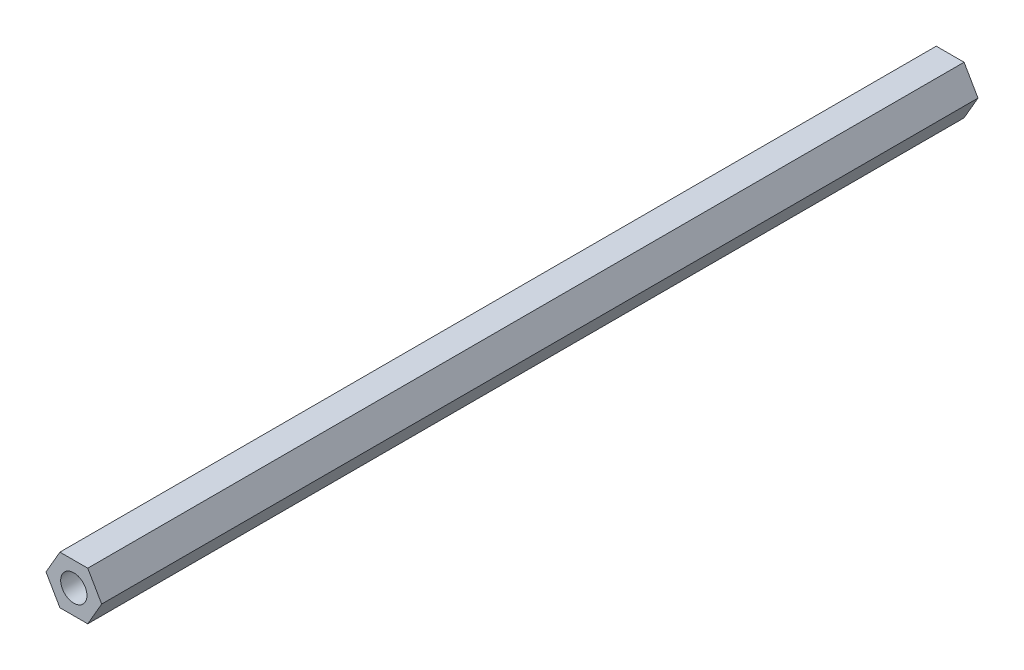
ISO-10303-21;
HEADER;
FILE_DESCRIPTION(('STEP AP214'),'2;1');
FILE_NAME('part.step','',(''),(''),'','','');
FILE_SCHEMA(('AUTOMOTIVE_DESIGN { 1 0 10303 214 1 1 1 1 }'));
ENDSEC;
DATA;
#1=APPLICATION_CONTEXT('core data for automotive mechanical design processes');
#2=APPLICATION_PROTOCOL_DEFINITION('international standard','automotive_design',2000,#1);
#3=PRODUCT_CONTEXT('',#1,'mechanical');
#4=PRODUCT('Part','Part','',(#3));
#5=PRODUCT_RELATED_PRODUCT_CATEGORY('part','',(#4));
#6=PRODUCT_DEFINITION_FORMATION('','',#4);
#7=PRODUCT_DEFINITION_CONTEXT('part definition',#1,'design');
#8=PRODUCT_DEFINITION('design','',#6,#7);
#9=PRODUCT_DEFINITION_SHAPE('','',#8);
#10=(LENGTH_UNIT() NAMED_UNIT(*) SI_UNIT(.MILLI.,.METRE.));
#11=(NAMED_UNIT(*) PLANE_ANGLE_UNIT() SI_UNIT($,.RADIAN.));
#12=(NAMED_UNIT(*) SI_UNIT($,.STERADIAN.) SOLID_ANGLE_UNIT());
#13=UNCERTAINTY_MEASURE_WITH_UNIT(LENGTH_MEASURE(1.E-05),#10,'distance_accuracy_value','');
#14=(GEOMETRIC_REPRESENTATION_CONTEXT(3) GLOBAL_UNCERTAINTY_ASSIGNED_CONTEXT((#13)) GLOBAL_UNIT_ASSIGNED_CONTEXT((#10,
#11,#12)) REPRESENTATION_CONTEXT('',''));
#15=CARTESIAN_POINT('',(0.,0.,0.));
#16=DIRECTION('',(0.,0.,1.));
#17=DIRECTION('',(1.,0.,0.));
#18=AXIS2_PLACEMENT_3D('',#15,#16,#17);
#19=CARTESIAN_POINT('',(-1.58771324027147,-2.75,100.));
#20=DIRECTION('',(0.,1.,0.));
#21=DIRECTION('',(-1.,0.,0.));
#22=AXIS2_PLACEMENT_3D('',#19,#20,#21);
#23=PLANE('',#22);
#24=DIRECTION('',(1.,0.,0.));
#25=VECTOR('',#24,1.);
#26=CARTESIAN_POINT('',(-1.58771324027147,-2.75,0.));
#27=LINE('',#26,#25);
#28=CARTESIAN_POINT('',(-1.58771324027147,-2.75,0.));
#29=VERTEX_POINT('',#28);
#30=CARTESIAN_POINT('',(1.58771324027147,-2.75,0.));
#31=VERTEX_POINT('',#30);
#32=EDGE_CURVE('E119',#29,#31,#27,.T.);
#33=ORIENTED_EDGE('',*,*,#32,.T.);
#34=DIRECTION('',(0.,0.,-1.));
#35=VECTOR('',#34,1.);
#36=CARTESIAN_POINT('',(1.58771324027147,-2.75,100.));
#37=LINE('',#36,#35);
#38=CARTESIAN_POINT('',(1.58771324027147,-2.75,100.));
#39=VERTEX_POINT('',#38);
#40=EDGE_CURVE('E11',#39,#31,#37,.T.);
#41=ORIENTED_EDGE('',*,*,#40,.F.);
#42=DIRECTION('',(1.,0.,0.));
#43=VECTOR('',#42,1.);
#44=CARTESIAN_POINT('',(-1.58771324027147,-2.75,100.));
#45=LINE('',#44,#43);
#46=CARTESIAN_POINT('',(-1.58771324027147,-2.75,100.));
#47=VERTEX_POINT('',#46);
#48=EDGE_CURVE('E130',#47,#39,#45,.T.);
#49=ORIENTED_EDGE('',*,*,#48,.F.);
#50=DIRECTION('',(0.,0.,-1.));
#51=VECTOR('',#50,1.);
#52=CARTESIAN_POINT('',(-1.58771324027147,-2.75,100.));
#53=LINE('',#52,#51);
#54=EDGE_CURVE('E115',#47,#29,#53,.T.);
#55=ORIENTED_EDGE('',*,*,#54,.T.);
#56=EDGE_LOOP('',(#33,#41,#49,#55));
#57=FACE_BOUND('',#56,.T.);
#58=ADVANCED_FACE('F35',(#57),#23,.F.);
#59=CARTESIAN_POINT('',(1.58771324027147,-2.75,100.));
#60=DIRECTION('',(-0.866025403784439,0.5,0.));
#61=DIRECTION('',(-0.5,-0.866025403784439,0.));
#62=AXIS2_PLACEMENT_3D('',#59,#60,#61);
#63=PLANE('',#62);
#64=DIRECTION('',(0.5,0.866025403784439,0.));
#65=VECTOR('',#64,1.);
#66=CARTESIAN_POINT('',(1.58771324027147,-2.75,0.));
#67=LINE('',#66,#65);
#68=CARTESIAN_POINT('',(3.17542648054294,0.,0.));
#69=VERTEX_POINT('',#68);
#70=EDGE_CURVE('E122',#31,#69,#67,.T.);
#71=ORIENTED_EDGE('',*,*,#70,.T.);
#72=DIRECTION('',(0.,0.,-1.));
#73=VECTOR('',#72,1.);
#74=CARTESIAN_POINT('',(3.17542648054294,0.,100.));
#75=LINE('',#74,#73);
#76=CARTESIAN_POINT('',(3.17542648054294,0.,100.));
#77=VERTEX_POINT('',#76);
#78=EDGE_CURVE('E43',#77,#69,#75,.T.);
#79=ORIENTED_EDGE('',*,*,#78,.F.);
#80=DIRECTION('',(0.5,0.866025403784439,0.));
#81=VECTOR('',#80,1.);
#82=CARTESIAN_POINT('',(1.58771324027147,-2.75,100.));
#83=LINE('',#82,#81);
#84=EDGE_CURVE('E88',#39,#77,#83,.T.);
#85=ORIENTED_EDGE('',*,*,#84,.F.);
#86=ORIENTED_EDGE('',*,*,#40,.T.);
#87=EDGE_LOOP('',(#71,#79,#85,#86));
#88=FACE_BOUND('',#87,.T.);
#89=ADVANCED_FACE('F155',(#88),#63,.F.);
#90=CARTESIAN_POINT('',(3.17542648054294,0.,100.));
#91=DIRECTION('',(-0.866025403784439,-0.5,0.));
#92=DIRECTION('',(0.5,-0.866025403784439,0.));
#93=AXIS2_PLACEMENT_3D('',#90,#91,#92);
#94=PLANE('',#93);
#95=DIRECTION('',(-0.5,0.866025403784439,0.));
#96=VECTOR('',#95,1.);
#97=CARTESIAN_POINT('',(3.17542648054294,0.,0.));
#98=LINE('',#97,#96);
#99=CARTESIAN_POINT('',(1.58771324027147,2.75,0.));
#100=VERTEX_POINT('',#99);
#101=EDGE_CURVE('E125',#69,#100,#98,.T.);
#102=ORIENTED_EDGE('',*,*,#101,.T.);
#103=DIRECTION('',(0.,0.,-1.));
#104=VECTOR('',#103,1.);
#105=CARTESIAN_POINT('',(1.58771324027147,2.75,100.));
#106=LINE('',#105,#104);
#107=CARTESIAN_POINT('',(1.58771324027147,2.75,100.));
#108=VERTEX_POINT('',#107);
#109=EDGE_CURVE('E110',#108,#100,#106,.T.);
#110=ORIENTED_EDGE('',*,*,#109,.F.);
#111=DIRECTION('',(-0.5,0.866025403784439,0.));
#112=VECTOR('',#111,1.);
#113=CARTESIAN_POINT('',(3.17542648054294,0.,100.));
#114=LINE('',#113,#112);
#115=EDGE_CURVE('E101',#77,#108,#114,.T.);
#116=ORIENTED_EDGE('',*,*,#115,.F.);
#117=ORIENTED_EDGE('',*,*,#78,.T.);
#118=EDGE_LOOP('',(#102,#110,#116,#117));
#119=FACE_BOUND('',#118,.T.);
#120=ADVANCED_FACE('F136',(#119),#94,.F.);
#121=CARTESIAN_POINT('',(1.58771324027147,2.75,100.));
#122=DIRECTION('',(0.,-1.,0.));
#123=DIRECTION('',(1.,0.,0.));
#124=AXIS2_PLACEMENT_3D('',#121,#122,#123);
#125=PLANE('',#124);
#126=DIRECTION('',(-1.,0.,0.));
#127=VECTOR('',#126,1.);
#128=CARTESIAN_POINT('',(1.58771324027147,2.75,0.));
#129=LINE('',#128,#127);
#130=CARTESIAN_POINT('',(-1.58771324027147,2.75,0.));
#131=VERTEX_POINT('',#130);
#132=EDGE_CURVE('E109',#100,#131,#129,.T.);
#133=ORIENTED_EDGE('',*,*,#132,.T.);
#134=DIRECTION('',(0.,0.,-1.));
#135=VECTOR('',#134,1.);
#136=CARTESIAN_POINT('',(-1.58771324027147,2.75,100.));
#137=LINE('',#136,#135);
#138=CARTESIAN_POINT('',(-1.58771324027147,2.75,100.));
#139=VERTEX_POINT('',#138);
#140=EDGE_CURVE('E106',#139,#131,#137,.T.);
#141=ORIENTED_EDGE('',*,*,#140,.F.);
#142=DIRECTION('',(-1.,0.,0.));
#143=VECTOR('',#142,1.);
#144=CARTESIAN_POINT('',(1.58771324027147,2.75,100.));
#145=LINE('',#144,#143);
#146=EDGE_CURVE('E95',#108,#139,#145,.T.);
#147=ORIENTED_EDGE('',*,*,#146,.F.);
#148=ORIENTED_EDGE('',*,*,#109,.T.);
#149=EDGE_LOOP('',(#133,#141,#147,#148));
#150=FACE_BOUND('',#149,.T.);
#151=ADVANCED_FACE('F107',(#150),#125,.F.);
#152=CARTESIAN_POINT('',(-1.58771324027147,2.75,100.));
#153=DIRECTION('',(0.866025403784439,-0.5,0.));
#154=DIRECTION('',(0.5,0.866025403784439,0.));
#155=AXIS2_PLACEMENT_3D('',#152,#153,#154);
#156=PLANE('',#155);
#157=DIRECTION('',(-0.5,-0.866025403784439,0.));
#158=VECTOR('',#157,1.);
#159=CARTESIAN_POINT('',(-1.58771324027147,2.75,0.));
#160=LINE('',#159,#158);
#161=CARTESIAN_POINT('',(-3.17542648054294,0.,0.));
#162=VERTEX_POINT('',#161);
#163=EDGE_CURVE('E74',#131,#162,#160,.T.);
#164=ORIENTED_EDGE('',*,*,#163,.T.);
#165=DIRECTION('',(0.,0.,-1.));
#166=VECTOR('',#165,1.);
#167=CARTESIAN_POINT('',(-3.17542648054294,0.,100.));
#168=LINE('',#167,#166);
#169=CARTESIAN_POINT('',(-3.17542648054294,0.,100.));
#170=VERTEX_POINT('',#169);
#171=EDGE_CURVE('E111',#170,#162,#168,.T.);
#172=ORIENTED_EDGE('',*,*,#171,.F.);
#173=DIRECTION('',(-0.5,-0.866025403784439,0.));
#174=VECTOR('',#173,1.);
#175=CARTESIAN_POINT('',(-1.58771324027147,2.75,100.));
#176=LINE('',#175,#174);
#177=EDGE_CURVE('E99',#139,#170,#176,.T.);
#178=ORIENTED_EDGE('',*,*,#177,.F.);
#179=ORIENTED_EDGE('',*,*,#140,.T.);
#180=EDGE_LOOP('',(#164,#172,#178,#179));
#181=FACE_BOUND('',#180,.T.);
#182=ADVANCED_FACE('F113',(#181),#156,.F.);
#183=CARTESIAN_POINT('',(-3.17542648054294,0.,100.));
#184=DIRECTION('',(0.866025403784439,0.5,0.));
#185=DIRECTION('',(-0.5,0.866025403784439,0.));
#186=AXIS2_PLACEMENT_3D('',#183,#184,#185);
#187=PLANE('',#186);
#188=DIRECTION('',(0.5,-0.866025403784439,0.));
#189=VECTOR('',#188,1.);
#190=CARTESIAN_POINT('',(-3.17542648054294,0.,0.));
#191=LINE('',#190,#189);
#192=EDGE_CURVE('E80',#162,#29,#191,.T.);
#193=ORIENTED_EDGE('',*,*,#192,.T.);
#194=ORIENTED_EDGE('',*,*,#54,.F.);
#195=DIRECTION('',(0.5,-0.866025403784439,0.));
#196=VECTOR('',#195,1.);
#197=CARTESIAN_POINT('',(-3.17542648054294,0.,100.));
#198=LINE('',#197,#196);
#199=EDGE_CURVE('E51',#170,#47,#198,.T.);
#200=ORIENTED_EDGE('',*,*,#199,.F.);
#201=ORIENTED_EDGE('',*,*,#171,.T.);
#202=EDGE_LOOP('',(#193,#194,#200,#201));
#203=FACE_BOUND('',#202,.T.);
#204=ADVANCED_FACE('F143',(#203),#187,.F.);
#205=CARTESIAN_POINT('',(0.,0.,100.));
#206=DIRECTION('',(0.,0.,1.));
#207=DIRECTION('',(1.,0.,0.));
#208=AXIS2_PLACEMENT_3D('',#205,#206,#207);
#209=PLANE('',#208);
#210=CARTESIAN_POINT('',(0.,0.,100.));
#211=DIRECTION('',(0.,0.,1.));
#212=DIRECTION('',(1.,0.,0.));
#213=AXIS2_PLACEMENT_3D('',#210,#211,#212);
#214=CIRCLE('',#213,1.5);
#215=CARTESIAN_POINT('',(1.5,0.,100.));
#216=VERTEX_POINT('',#215);
#217=EDGE_CURVE('E239',#216,#216,#214,.T.);
#218=ORIENTED_EDGE('',*,*,#217,.F.);
#219=EDGE_LOOP('',(#218));
#220=FACE_BOUND('',#219,.T.);
#221=ORIENTED_EDGE('',*,*,#48,.T.);
#222=ORIENTED_EDGE('',*,*,#84,.T.);
#223=ORIENTED_EDGE('',*,*,#115,.T.);
#224=ORIENTED_EDGE('',*,*,#146,.T.);
#225=ORIENTED_EDGE('',*,*,#177,.T.);
#226=ORIENTED_EDGE('',*,*,#199,.T.);
#227=EDGE_LOOP('',(#221,#222,#223,#224,#225,#226));
#228=FACE_BOUND('',#227,.T.);
#229=ADVANCED_FACE('F97',(#220,#228),#209,.T.);
#230=CARTESIAN_POINT('',(0.,0.,0.));
#231=DIRECTION('',(0.,0.,1.));
#232=DIRECTION('',(1.,0.,0.));
#233=AXIS2_PLACEMENT_3D('',#230,#231,#232);
#234=PLANE('',#233);
#235=CARTESIAN_POINT('',(0.,0.,0.));
#236=DIRECTION('',(0.,0.,-1.));
#237=DIRECTION('',(-1.,0.,0.));
#238=AXIS2_PLACEMENT_3D('',#235,#236,#237);
#239=CIRCLE('',#238,1.5);
#240=CARTESIAN_POINT('',(-1.5,0.,0.));
#241=VERTEX_POINT('',#240);
#242=EDGE_CURVE('E238',#241,#241,#239,.T.);
#243=ORIENTED_EDGE('',*,*,#242,.F.);
#244=EDGE_LOOP('',(#243));
#245=FACE_BOUND('',#244,.T.);
#246=ORIENTED_EDGE('',*,*,#32,.F.);
#247=ORIENTED_EDGE('',*,*,#192,.F.);
#248=ORIENTED_EDGE('',*,*,#163,.F.);
#249=ORIENTED_EDGE('',*,*,#132,.F.);
#250=ORIENTED_EDGE('',*,*,#101,.F.);
#251=ORIENTED_EDGE('',*,*,#70,.F.);
#252=EDGE_LOOP('',(#246,#247,#248,#249,#250,#251));
#253=FACE_BOUND('',#252,.T.);
#254=ADVANCED_FACE('F139',(#245,#253),#234,.F.);
#255=CARTESIAN_POINT('',(0.,0.,10.));
#256=DIRECTION('',(0.,0.,-1.));
#257=DIRECTION('',(-1.,0.,0.));
#258=AXIS2_PLACEMENT_3D('',#255,#256,#257);
#259=CYLINDRICAL_SURFACE('',#258,1.5);
#260=CARTESIAN_POINT('',(0.,0.,10.));
#261=DIRECTION('',(0.,0.,-1.));
#262=DIRECTION('',(-1.,0.,0.));
#263=AXIS2_PLACEMENT_3D('',#260,#261,#262);
#264=CIRCLE('',#263,1.5);
#265=CARTESIAN_POINT('',(-1.5,0.,10.));
#266=VERTEX_POINT('',#265);
#267=EDGE_CURVE('E123',#266,#266,#264,.T.);
#268=ORIENTED_EDGE('',*,*,#267,.F.);
#269=EDGE_LOOP('',(#268));
#270=FACE_BOUND('',#269,.T.);
#271=ORIENTED_EDGE('',*,*,#242,.T.);
#272=EDGE_LOOP('',(#271));
#273=FACE_BOUND('',#272,.T.);
#274=ADVANCED_FACE('F187',(#270,#273),#259,.F.);
#275=CARTESIAN_POINT('',(0.,0.,10.));
#276=DIRECTION('',(0.,0.,-1.));
#277=DIRECTION('',(-1.,0.,0.));
#278=AXIS2_PLACEMENT_3D('',#275,#276,#277);
#279=PLANE('',#278);
#280=ORIENTED_EDGE('',*,*,#267,.T.);
#281=EDGE_LOOP('',(#280));
#282=FACE_BOUND('',#281,.T.);
#283=ADVANCED_FACE('F196',(#282),#279,.T.);
#284=CARTESIAN_POINT('',(0.,0.,90.));
#285=DIRECTION('',(0.,0.,1.));
#286=DIRECTION('',(1.,0.,0.));
#287=AXIS2_PLACEMENT_3D('',#284,#285,#286);
#288=CYLINDRICAL_SURFACE('',#287,1.5);
#289=CARTESIAN_POINT('',(0.,0.,90.));
#290=DIRECTION('',(0.,0.,1.));
#291=DIRECTION('',(1.,0.,0.));
#292=AXIS2_PLACEMENT_3D('',#289,#290,#291);
#293=CIRCLE('',#292,1.5);
#294=CARTESIAN_POINT('',(1.5,0.,90.));
#295=VERTEX_POINT('',#294);
#296=EDGE_CURVE('E237',#295,#295,#293,.T.);
#297=ORIENTED_EDGE('',*,*,#296,.F.);
#298=EDGE_LOOP('',(#297));
#299=FACE_BOUND('',#298,.T.);
#300=ORIENTED_EDGE('',*,*,#217,.T.);
#301=EDGE_LOOP('',(#300));
#302=FACE_BOUND('',#301,.T.);
#303=ADVANCED_FACE('F206',(#299,#302),#288,.F.);
#304=CARTESIAN_POINT('',(0.,0.,90.));
#305=DIRECTION('',(0.,0.,1.));
#306=DIRECTION('',(1.,0.,0.));
#307=AXIS2_PLACEMENT_3D('',#304,#305,#306);
#308=PLANE('',#307);
#309=ORIENTED_EDGE('',*,*,#296,.T.);
#310=EDGE_LOOP('',(#309));
#311=FACE_BOUND('',#310,.T.);
#312=ADVANCED_FACE('F221',(#311),#308,.T.);
#313=CLOSED_SHELL('',(#58,#89,#120,#151,#182,#204,#229,#254,#274,#283,#303,#312));
#314=MANIFOLD_SOLID_BREP('B2',#313);
#315=ADVANCED_BREP_SHAPE_REPRESENTATION('',(#18,#314),#14);
#316=SHAPE_DEFINITION_REPRESENTATION(#9,#315);
ENDSEC;
END-ISO-10303-21;
